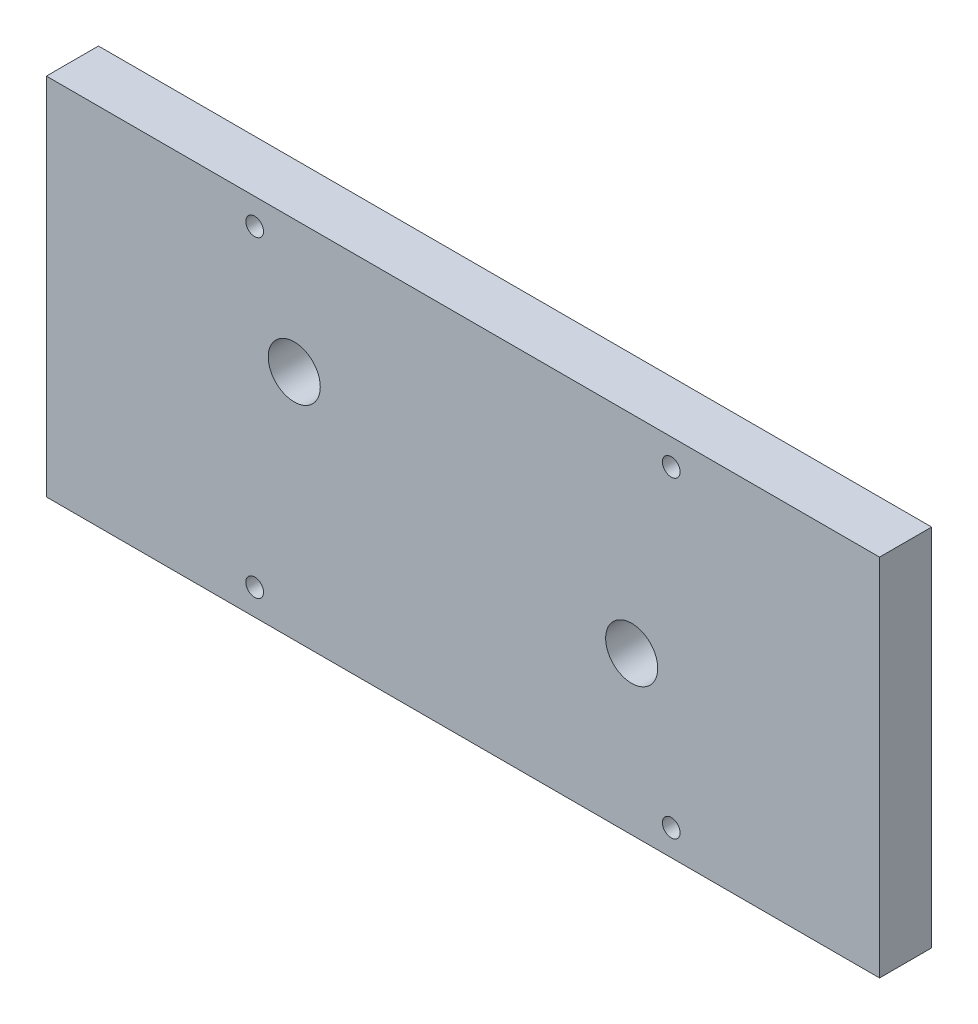
ISO-10303-21;
HEADER;
FILE_DESCRIPTION(('STEP AP214'),'2;1');
FILE_NAME('part.step','',(''),(''),'','','');
FILE_SCHEMA(('AUTOMOTIVE_DESIGN { 1 0 10303 214 1 1 1 1 }'));
ENDSEC;
DATA;
#1=APPLICATION_CONTEXT('core data for automotive mechanical design processes');
#2=APPLICATION_PROTOCOL_DEFINITION('international standard','automotive_design',2000,#1);
#3=PRODUCT_CONTEXT('',#1,'mechanical');
#4=PRODUCT('Part','Part','',(#3));
#5=PRODUCT_RELATED_PRODUCT_CATEGORY('part','',(#4));
#6=PRODUCT_DEFINITION_FORMATION('','',#4);
#7=PRODUCT_DEFINITION_CONTEXT('part definition',#1,'design');
#8=PRODUCT_DEFINITION('design','',#6,#7);
#9=PRODUCT_DEFINITION_SHAPE('','',#8);
#10=(LENGTH_UNIT() NAMED_UNIT(*) SI_UNIT(.MILLI.,.METRE.));
#11=(NAMED_UNIT(*) PLANE_ANGLE_UNIT() SI_UNIT($,.RADIAN.));
#12=(NAMED_UNIT(*) SI_UNIT($,.STERADIAN.) SOLID_ANGLE_UNIT());
#13=UNCERTAINTY_MEASURE_WITH_UNIT(LENGTH_MEASURE(1.E-05),#10,'distance_accuracy_value','');
#14=(GEOMETRIC_REPRESENTATION_CONTEXT(3) GLOBAL_UNCERTAINTY_ASSIGNED_CONTEXT((#13)) GLOBAL_UNIT_ASSIGNED_CONTEXT((#10,
#11,#12)) REPRESENTATION_CONTEXT('',''));
#15=CARTESIAN_POINT('',(0.,0.,0.));
#16=DIRECTION('',(0.,0.,1.));
#17=DIRECTION('',(1.,0.,0.));
#18=AXIS2_PLACEMENT_3D('',#15,#16,#17);
#19=CARTESIAN_POINT('',(-146.819307324439,520.108658774627,82.2731107004053));
#20=DIRECTION('',(1.,0.,0.));
#21=DIRECTION('',(0.,0.,-1.));
#22=AXIS2_PLACEMENT_3D('',#19,#20,#21);
#23=PLANE('',#22);
#24=DIRECTION('',(0.,1.,0.));
#25=VECTOR('',#24,1.);
#26=CARTESIAN_POINT('',(-146.819307324439,520.108658774627,92.2731107004053));
#27=LINE('',#26,#25);
#28=CARTESIAN_POINT('',(-146.819307324439,450.108658774627,92.2731107004053));
#29=VERTEX_POINT('',#28);
#30=CARTESIAN_POINT('',(-146.819307324439,520.108658774627,92.2731107004053));
#31=VERTEX_POINT('',#30);
#32=EDGE_CURVE('E97',#29,#31,#27,.T.);
#33=ORIENTED_EDGE('',*,*,#32,.T.);
#34=DIRECTION('',(0.,0.,1.));
#35=VECTOR('',#34,1.);
#36=CARTESIAN_POINT('',(-146.819307324439,520.108658774627,82.2731107004053));
#37=LINE('',#36,#35);
#38=CARTESIAN_POINT('',(-146.819307324439,520.108658774627,82.2731107004053));
#39=VERTEX_POINT('',#38);
#40=EDGE_CURVE('E11',#39,#31,#37,.T.);
#41=ORIENTED_EDGE('',*,*,#40,.F.);
#42=DIRECTION('',(0.,1.,0.));
#43=VECTOR('',#42,1.);
#44=CARTESIAN_POINT('',(-146.819307324439,520.108658774627,82.2731107004053));
#45=LINE('',#44,#43);
#46=CARTESIAN_POINT('',(-146.819307324439,450.108658774627,82.2731107004053));
#47=VERTEX_POINT('',#46);
#48=EDGE_CURVE('E84',#47,#39,#45,.T.);
#49=ORIENTED_EDGE('',*,*,#48,.F.);
#50=DIRECTION('',(0.,0.,1.));
#51=VECTOR('',#50,1.);
#52=CARTESIAN_POINT('',(-146.819307324439,450.108658774627,82.2731107004053));
#53=LINE('',#52,#51);
#54=EDGE_CURVE('E93',#47,#29,#53,.T.);
#55=ORIENTED_EDGE('',*,*,#54,.T.);
#56=EDGE_LOOP('',(#33,#41,#49,#55));
#57=FACE_BOUND('',#56,.T.);
#58=ADVANCED_FACE('F31',(#57),#23,.F.);
#59=CARTESIAN_POINT('',(-146.819307324439,520.108658774627,82.2731107004053));
#60=DIRECTION('',(0.,-1.,0.));
#61=DIRECTION('',(0.,0.,-1.));
#62=AXIS2_PLACEMENT_3D('',#59,#60,#61);
#63=PLANE('',#62);
#64=DIRECTION('',(1.,0.,0.));
#65=VECTOR('',#64,1.);
#66=CARTESIAN_POINT('',(-146.819307324439,520.108658774627,92.2731107004053));
#67=LINE('',#66,#65);
#68=CARTESIAN_POINT('',(13.1806926755614,520.108658774627,92.2731107004053));
#69=VERTEX_POINT('',#68);
#70=EDGE_CURVE('E88',#31,#69,#67,.T.);
#71=ORIENTED_EDGE('',*,*,#70,.T.);
#72=DIRECTION('',(0.,0.,1.));
#73=VECTOR('',#72,1.);
#74=CARTESIAN_POINT('',(13.1806926755614,520.108658774627,82.2731107004053));
#75=LINE('',#74,#73);
#76=CARTESIAN_POINT('',(13.1806926755614,520.108658774627,82.2731107004053));
#77=VERTEX_POINT('',#76);
#78=EDGE_CURVE('E40',#77,#69,#75,.T.);
#79=ORIENTED_EDGE('',*,*,#78,.F.);
#80=DIRECTION('',(1.,0.,0.));
#81=VECTOR('',#80,1.);
#82=CARTESIAN_POINT('',(-146.819307324439,520.108658774627,82.2731107004053));
#83=LINE('',#82,#81);
#84=EDGE_CURVE('E79',#39,#77,#83,.T.);
#85=ORIENTED_EDGE('',*,*,#84,.F.);
#86=ORIENTED_EDGE('',*,*,#40,.T.);
#87=EDGE_LOOP('',(#71,#79,#85,#86));
#88=FACE_BOUND('',#87,.T.);
#89=ADVANCED_FACE('F87',(#88),#63,.F.);
#90=CARTESIAN_POINT('',(13.1806926755614,520.108658774627,82.2731107004053));
#91=DIRECTION('',(-1.,0.,0.));
#92=DIRECTION('',(0.,-1.,0.));
#93=AXIS2_PLACEMENT_3D('',#90,#91,#92);
#94=PLANE('',#93);
#95=DIRECTION('',(0.,-1.,0.));
#96=VECTOR('',#95,1.);
#97=CARTESIAN_POINT('',(13.1806926755614,520.108658774627,92.2731107004053));
#98=LINE('',#97,#96);
#99=CARTESIAN_POINT('',(13.1806926755614,450.108658774627,92.2731107004053));
#100=VERTEX_POINT('',#99);
#101=EDGE_CURVE('E66',#69,#100,#98,.T.);
#102=ORIENTED_EDGE('',*,*,#101,.T.);
#103=DIRECTION('',(0.,0.,1.));
#104=VECTOR('',#103,1.);
#105=CARTESIAN_POINT('',(13.1806926755614,450.108658774627,82.2731107004053));
#106=LINE('',#105,#104);
#107=CARTESIAN_POINT('',(13.1806926755614,450.108658774627,82.2731107004053));
#108=VERTEX_POINT('',#107);
#109=EDGE_CURVE('E89',#108,#100,#106,.T.);
#110=ORIENTED_EDGE('',*,*,#109,.F.);
#111=DIRECTION('',(0.,-1.,0.));
#112=VECTOR('',#111,1.);
#113=CARTESIAN_POINT('',(13.1806926755614,520.108658774627,82.2731107004053));
#114=LINE('',#113,#112);
#115=EDGE_CURVE('E82',#77,#108,#114,.T.);
#116=ORIENTED_EDGE('',*,*,#115,.F.);
#117=ORIENTED_EDGE('',*,*,#78,.T.);
#118=EDGE_LOOP('',(#102,#110,#116,#117));
#119=FACE_BOUND('',#118,.T.);
#120=ADVANCED_FACE('F91',(#119),#94,.F.);
#121=CARTESIAN_POINT('',(-146.819307324439,450.108658774627,82.2731107004053));
#122=DIRECTION('',(0.,1.,0.));
#123=DIRECTION('',(0.,0.,1.));
#124=AXIS2_PLACEMENT_3D('',#121,#122,#123);
#125=PLANE('',#124);
#126=DIRECTION('',(-1.,0.,0.));
#127=VECTOR('',#126,1.);
#128=CARTESIAN_POINT('',(-146.819307324439,450.108658774627,92.2731107004053));
#129=LINE('',#128,#127);
#130=EDGE_CURVE('E72',#100,#29,#129,.T.);
#131=ORIENTED_EDGE('',*,*,#130,.T.);
#132=ORIENTED_EDGE('',*,*,#54,.F.);
#133=DIRECTION('',(-1.,0.,0.));
#134=VECTOR('',#133,1.);
#135=CARTESIAN_POINT('',(-146.819307324439,450.108658774627,82.2731107004053));
#136=LINE('',#135,#134);
#137=EDGE_CURVE('E49',#108,#47,#136,.T.);
#138=ORIENTED_EDGE('',*,*,#137,.F.);
#139=ORIENTED_EDGE('',*,*,#109,.T.);
#140=EDGE_LOOP('',(#131,#132,#138,#139));
#141=FACE_BOUND('',#140,.T.);
#142=ADVANCED_FACE('F158',(#141),#125,.F.);
#143=CARTESIAN_POINT('',(-146.819307324439,450.108658774627,82.2731107004053));
#144=DIRECTION('',(0.,0.,1.));
#145=DIRECTION('',(1.,0.,0.));
#146=AXIS2_PLACEMENT_3D('',#143,#144,#145);
#147=PLANE('',#146);
#148=CARTESIAN_POINT('',(-99.2193073244386,494.708658774627,82.2731107004053));
#149=DIRECTION('',(0.,0.,1.));
#150=DIRECTION('',(1.,0.,0.));
#151=AXIS2_PLACEMENT_3D('',#148,#149,#150);
#152=CIRCLE('',#151,3.29999999999999);
#153=CARTESIAN_POINT('',(-95.9193073244386,494.708658774627,82.2731107004053));
#154=VERTEX_POINT('',#153);
#155=EDGE_CURVE('E295',#154,#154,#152,.T.);
#156=ORIENTED_EDGE('',*,*,#155,.T.);
#157=EDGE_LOOP('',(#156));
#158=FACE_BOUND('',#157,.T.);
#159=CARTESIAN_POINT('',(-34.4193073244386,480.308658774627,82.2731107004053));
#160=DIRECTION('',(0.,0.,1.));
#161=DIRECTION('',(1.,0.,0.));
#162=AXIS2_PLACEMENT_3D('',#159,#160,#161);
#163=CIRCLE('',#162,3.29999999999999);
#164=CARTESIAN_POINT('',(-31.1193073244386,480.308658774627,82.2731107004053));
#165=VERTEX_POINT('',#164);
#166=EDGE_CURVE('E304',#165,#165,#163,.T.);
#167=ORIENTED_EDGE('',*,*,#166,.T.);
#168=EDGE_LOOP('',(#167));
#169=FACE_BOUND('',#168,.T.);
#170=CARTESIAN_POINT('',(-106.819307324439,515.108658774627,82.2731107004053));
#171=DIRECTION('',(0.,0.,1.));
#172=DIRECTION('',(1.,0.,0.));
#173=AXIS2_PLACEMENT_3D('',#170,#171,#172);
#174=CIRCLE('',#173,1.69999999999999);
#175=CARTESIAN_POINT('',(-105.119307324439,515.108658774627,82.2731107004053));
#176=VERTEX_POINT('',#175);
#177=EDGE_CURVE('E112',#176,#176,#174,.T.);
#178=ORIENTED_EDGE('',*,*,#177,.T.);
#179=EDGE_LOOP('',(#178));
#180=FACE_BOUND('',#179,.T.);
#181=CARTESIAN_POINT('',(-26.8193073244385,515.108658774627,82.2731107004053));
#182=DIRECTION('',(0.,0.,1.));
#183=DIRECTION('',(1.,0.,0.));
#184=AXIS2_PLACEMENT_3D('',#181,#182,#183);
#185=CIRCLE('',#184,1.69999999999999);
#186=CARTESIAN_POINT('',(-25.1193073244385,515.108658774627,82.2731107004053));
#187=VERTEX_POINT('',#186);
#188=EDGE_CURVE('E128',#187,#187,#185,.T.);
#189=ORIENTED_EDGE('',*,*,#188,.T.);
#190=EDGE_LOOP('',(#189));
#191=FACE_BOUND('',#190,.T.);
#192=CARTESIAN_POINT('',(-26.8193073244385,455.108658774627,82.2731107004053));
#193=DIRECTION('',(0.,0.,1.));
#194=DIRECTION('',(1.,0.,0.));
#195=AXIS2_PLACEMENT_3D('',#192,#193,#194);
#196=CIRCLE('',#195,1.69999999999999);
#197=CARTESIAN_POINT('',(-25.1193073244385,455.108658774627,82.2731107004053));
#198=VERTEX_POINT('',#197);
#199=EDGE_CURVE('E134',#198,#198,#196,.T.);
#200=ORIENTED_EDGE('',*,*,#199,.T.);
#201=EDGE_LOOP('',(#200));
#202=FACE_BOUND('',#201,.T.);
#203=CARTESIAN_POINT('',(-106.819307324439,455.108658774627,82.2731107004053));
#204=DIRECTION('',(0.,0.,1.));
#205=DIRECTION('',(1.,0.,0.));
#206=AXIS2_PLACEMENT_3D('',#203,#204,#205);
#207=CIRCLE('',#206,1.69999999999999);
#208=CARTESIAN_POINT('',(-105.119307324439,455.108658774627,82.2731107004053));
#209=VERTEX_POINT('',#208);
#210=EDGE_CURVE('E100',#209,#209,#207,.T.);
#211=ORIENTED_EDGE('',*,*,#210,.T.);
#212=EDGE_LOOP('',(#211));
#213=FACE_BOUND('',#212,.T.);
#214=ORIENTED_EDGE('',*,*,#48,.T.);
#215=ORIENTED_EDGE('',*,*,#84,.T.);
#216=ORIENTED_EDGE('',*,*,#115,.T.);
#217=ORIENTED_EDGE('',*,*,#137,.T.);
#218=EDGE_LOOP('',(#214,#215,#216,#217));
#219=FACE_BOUND('',#218,.T.);
#220=ADVANCED_FACE('F80',(#158,#169,#180,#191,#202,#213,#219),#147,.F.);
#221=CARTESIAN_POINT('',(-146.819307324439,450.108658774627,92.2731107004053));
#222=DIRECTION('',(0.,0.,1.));
#223=DIRECTION('',(1.,0.,0.));
#224=AXIS2_PLACEMENT_3D('',#221,#222,#223);
#225=PLANE('',#224);
#226=CARTESIAN_POINT('',(-99.2193073244386,494.708658774627,92.2731107004053));
#227=DIRECTION('',(0.,0.,1.));
#228=DIRECTION('',(1.,0.,0.));
#229=AXIS2_PLACEMENT_3D('',#226,#227,#228);
#230=CIRCLE('',#229,5.00000000000001);
#231=CARTESIAN_POINT('',(-94.2193073244386,494.708658774627,92.2731107004053));
#232=VERTEX_POINT('',#231);
#233=EDGE_CURVE('E34',#232,#232,#230,.T.);
#234=ORIENTED_EDGE('',*,*,#233,.F.);
#235=EDGE_LOOP('',(#234));
#236=FACE_BOUND('',#235,.T.);
#237=CARTESIAN_POINT('',(-34.4193073244386,480.308658774627,92.2731107004053));
#238=DIRECTION('',(0.,0.,1.));
#239=DIRECTION('',(1.,0.,0.));
#240=AXIS2_PLACEMENT_3D('',#237,#238,#239);
#241=CIRCLE('',#240,5.);
#242=CARTESIAN_POINT('',(-29.4193073244386,480.308658774627,92.2731107004053));
#243=VERTEX_POINT('',#242);
#244=EDGE_CURVE('E105',#243,#243,#241,.T.);
#245=ORIENTED_EDGE('',*,*,#244,.F.);
#246=EDGE_LOOP('',(#245));
#247=FACE_BOUND('',#246,.T.);
#248=CARTESIAN_POINT('',(-106.819307324439,515.108658774627,92.2731107004053));
#249=DIRECTION('',(0.,0.,1.));
#250=DIRECTION('',(1.,0.,0.));
#251=AXIS2_PLACEMENT_3D('',#248,#249,#250);
#252=CIRCLE('',#251,1.69999999999999);
#253=CARTESIAN_POINT('',(-105.119307324439,515.108658774627,92.2731107004053));
#254=VERTEX_POINT('',#253);
#255=EDGE_CURVE('E107',#254,#254,#252,.T.);
#256=ORIENTED_EDGE('',*,*,#255,.F.);
#257=EDGE_LOOP('',(#256));
#258=FACE_BOUND('',#257,.T.);
#259=CARTESIAN_POINT('',(-26.8193073244385,515.108658774627,92.2731107004053));
#260=DIRECTION('',(0.,0.,1.));
#261=DIRECTION('',(1.,0.,0.));
#262=AXIS2_PLACEMENT_3D('',#259,#260,#261);
#263=CIRCLE('',#262,1.69999999999999);
#264=CARTESIAN_POINT('',(-25.1193073244386,515.108658774627,92.2731107004053));
#265=VERTEX_POINT('',#264);
#266=EDGE_CURVE('E125',#265,#265,#263,.T.);
#267=ORIENTED_EDGE('',*,*,#266,.F.);
#268=EDGE_LOOP('',(#267));
#269=FACE_BOUND('',#268,.T.);
#270=CARTESIAN_POINT('',(-26.8193073244385,455.108658774627,92.2731107004053));
#271=DIRECTION('',(0.,0.,1.));
#272=DIRECTION('',(1.,0.,0.));
#273=AXIS2_PLACEMENT_3D('',#270,#271,#272);
#274=CIRCLE('',#273,1.69999999999999);
#275=CARTESIAN_POINT('',(-25.1193073244386,455.108658774627,92.2731107004053));
#276=VERTEX_POINT('',#275);
#277=EDGE_CURVE('E131',#276,#276,#274,.T.);
#278=ORIENTED_EDGE('',*,*,#277,.F.);
#279=EDGE_LOOP('',(#278));
#280=FACE_BOUND('',#279,.T.);
#281=CARTESIAN_POINT('',(-106.819307324439,455.108658774627,92.2731107004053));
#282=DIRECTION('',(0.,0.,1.));
#283=DIRECTION('',(1.,0.,0.));
#284=AXIS2_PLACEMENT_3D('',#281,#282,#283);
#285=CIRCLE('',#284,1.69999999999999);
#286=CARTESIAN_POINT('',(-105.119307324439,455.108658774627,92.2731107004053));
#287=VERTEX_POINT('',#286);
#288=EDGE_CURVE('E137',#287,#287,#285,.T.);
#289=ORIENTED_EDGE('',*,*,#288,.F.);
#290=EDGE_LOOP('',(#289));
#291=FACE_BOUND('',#290,.T.);
#292=ORIENTED_EDGE('',*,*,#32,.F.);
#293=ORIENTED_EDGE('',*,*,#130,.F.);
#294=ORIENTED_EDGE('',*,*,#101,.F.);
#295=ORIENTED_EDGE('',*,*,#70,.F.);
#296=EDGE_LOOP('',(#292,#293,#294,#295));
#297=FACE_BOUND('',#296,.T.);
#298=ADVANCED_FACE('F148',(#236,#247,#258,#269,#280,#291,#297),#225,.T.);
#299=CARTESIAN_POINT('',(-106.819307324439,455.108658774627,92.2731107004053));
#300=DIRECTION('',(0.,0.,1.));
#301=DIRECTION('',(1.,0.,0.));
#302=AXIS2_PLACEMENT_3D('',#299,#300,#301);
#303=CYLINDRICAL_SURFACE('',#302,1.69999999999999);
#304=ORIENTED_EDGE('',*,*,#210,.F.);
#305=EDGE_LOOP('',(#304));
#306=FACE_BOUND('',#305,.T.);
#307=ORIENTED_EDGE('',*,*,#288,.T.);
#308=EDGE_LOOP('',(#307));
#309=FACE_BOUND('',#308,.T.);
#310=ADVANCED_FACE('F144',(#306,#309),#303,.F.);
#311=CARTESIAN_POINT('',(-26.8193073244385,455.108658774627,92.2731107004053));
#312=DIRECTION('',(0.,0.,1.));
#313=DIRECTION('',(1.,0.,0.));
#314=AXIS2_PLACEMENT_3D('',#311,#312,#313);
#315=CYLINDRICAL_SURFACE('',#314,1.69999999999999);
#316=ORIENTED_EDGE('',*,*,#199,.F.);
#317=EDGE_LOOP('',(#316));
#318=FACE_BOUND('',#317,.T.);
#319=ORIENTED_EDGE('',*,*,#277,.T.);
#320=EDGE_LOOP('',(#319));
#321=FACE_BOUND('',#320,.T.);
#322=ADVANCED_FACE('F147',(#318,#321),#315,.F.);
#323=CARTESIAN_POINT('',(-26.8193073244385,515.108658774627,92.2731107004053));
#324=DIRECTION('',(0.,0.,1.));
#325=DIRECTION('',(1.,0.,0.));
#326=AXIS2_PLACEMENT_3D('',#323,#324,#325);
#327=CYLINDRICAL_SURFACE('',#326,1.69999999999999);
#328=ORIENTED_EDGE('',*,*,#188,.F.);
#329=EDGE_LOOP('',(#328));
#330=FACE_BOUND('',#329,.T.);
#331=ORIENTED_EDGE('',*,*,#266,.T.);
#332=EDGE_LOOP('',(#331));
#333=FACE_BOUND('',#332,.T.);
#334=ADVANCED_FACE('F199',(#330,#333),#327,.F.);
#335=CARTESIAN_POINT('',(-106.819307324439,515.108658774627,92.2731107004053));
#336=DIRECTION('',(0.,0.,1.));
#337=DIRECTION('',(1.,0.,0.));
#338=AXIS2_PLACEMENT_3D('',#335,#336,#337);
#339=CYLINDRICAL_SURFACE('',#338,1.69999999999999);
#340=ORIENTED_EDGE('',*,*,#177,.F.);
#341=EDGE_LOOP('',(#340));
#342=FACE_BOUND('',#341,.T.);
#343=ORIENTED_EDGE('',*,*,#255,.T.);
#344=EDGE_LOOP('',(#343));
#345=FACE_BOUND('',#344,.T.);
#346=ADVANCED_FACE('F209',(#342,#345),#339,.F.);
#347=CARTESIAN_POINT('',(-34.4193073244386,480.308658774627,83.7731107004053));
#348=DIRECTION('',(0.,0.,1.));
#349=DIRECTION('',(1.,0.,0.));
#350=AXIS2_PLACEMENT_3D('',#347,#348,#349);
#351=CYLINDRICAL_SURFACE('',#350,5.);
#352=ORIENTED_EDGE('',*,*,#244,.T.);
#353=EDGE_LOOP('',(#352));
#354=FACE_BOUND('',#353,.T.);
#355=CARTESIAN_POINT('',(-34.4193073244386,480.308658774627,83.7731107004053));
#356=DIRECTION('',(0.,0.,1.));
#357=DIRECTION('',(1.,0.,0.));
#358=AXIS2_PLACEMENT_3D('',#355,#356,#357);
#359=CIRCLE('',#358,5.);
#360=CARTESIAN_POINT('',(-29.4193073244386,480.308658774627,83.7731107004053));
#361=VERTEX_POINT('',#360);
#362=EDGE_CURVE('E108',#361,#361,#359,.T.);
#363=ORIENTED_EDGE('',*,*,#362,.F.);
#364=EDGE_LOOP('',(#363));
#365=FACE_BOUND('',#364,.T.);
#366=ADVANCED_FACE('F219',(#354,#365),#351,.F.);
#367=CARTESIAN_POINT('',(-34.4193073244386,480.308658774627,83.7731107004053));
#368=DIRECTION('',(0.,0.,1.));
#369=DIRECTION('',(1.,0.,0.));
#370=AXIS2_PLACEMENT_3D('',#367,#368,#369);
#371=PLANE('',#370);
#372=CARTESIAN_POINT('',(-34.4193073244386,480.308658774627,83.7731107004053));
#373=DIRECTION('',(0.,0.,1.));
#374=DIRECTION('',(1.,0.,0.));
#375=AXIS2_PLACEMENT_3D('',#372,#373,#374);
#376=CIRCLE('',#375,3.29999999999999);
#377=CARTESIAN_POINT('',(-31.1193073244386,480.308658774627,83.7731107004053));
#378=VERTEX_POINT('',#377);
#379=EDGE_CURVE('E300',#378,#378,#376,.T.);
#380=ORIENTED_EDGE('',*,*,#379,.F.);
#381=EDGE_LOOP('',(#380));
#382=FACE_BOUND('',#381,.T.);
#383=ORIENTED_EDGE('',*,*,#362,.T.);
#384=EDGE_LOOP('',(#383));
#385=FACE_BOUND('',#384,.T.);
#386=ADVANCED_FACE('F234',(#382,#385),#371,.T.);
#387=CARTESIAN_POINT('',(-99.2193073244386,494.708658774627,83.7731107004053));
#388=DIRECTION('',(0.,0.,1.));
#389=DIRECTION('',(1.,0.,0.));
#390=AXIS2_PLACEMENT_3D('',#387,#388,#389);
#391=CYLINDRICAL_SURFACE('',#390,5.00000000000001);
#392=ORIENTED_EDGE('',*,*,#233,.T.);
#393=EDGE_LOOP('',(#392));
#394=FACE_BOUND('',#393,.T.);
#395=CARTESIAN_POINT('',(-99.2193073244386,494.708658774627,83.7731107004053));
#396=DIRECTION('',(0.,0.,1.));
#397=DIRECTION('',(1.,0.,0.));
#398=AXIS2_PLACEMENT_3D('',#395,#396,#397);
#399=CIRCLE('',#398,5.00000000000001);
#400=CARTESIAN_POINT('',(-94.2193073244386,494.708658774627,83.7731107004053));
#401=VERTEX_POINT('',#400);
#402=EDGE_CURVE('E119',#401,#401,#399,.T.);
#403=ORIENTED_EDGE('',*,*,#402,.F.);
#404=EDGE_LOOP('',(#403));
#405=FACE_BOUND('',#404,.T.);
#406=ADVANCED_FACE('F241',(#394,#405),#391,.F.);
#407=CARTESIAN_POINT('',(-99.2193073244386,494.708658774627,83.7731107004053));
#408=DIRECTION('',(0.,0.,1.));
#409=DIRECTION('',(1.,0.,0.));
#410=AXIS2_PLACEMENT_3D('',#407,#408,#409);
#411=PLANE('',#410);
#412=CARTESIAN_POINT('',(-99.2193073244386,494.708658774627,83.7731107004053));
#413=DIRECTION('',(0.,0.,1.));
#414=DIRECTION('',(1.,0.,0.));
#415=AXIS2_PLACEMENT_3D('',#412,#413,#414);
#416=CIRCLE('',#415,3.29999999999998);
#417=CARTESIAN_POINT('',(-95.9193073244386,494.708658774627,83.7731107004053));
#418=VERTEX_POINT('',#417);
#419=EDGE_CURVE('E298',#418,#418,#416,.T.);
#420=ORIENTED_EDGE('',*,*,#419,.F.);
#421=EDGE_LOOP('',(#420));
#422=FACE_BOUND('',#421,.T.);
#423=ORIENTED_EDGE('',*,*,#402,.T.);
#424=EDGE_LOOP('',(#423));
#425=FACE_BOUND('',#424,.T.);
#426=ADVANCED_FACE('F246',(#422,#425),#411,.T.);
#427=CARTESIAN_POINT('',(-34.4193073244386,480.308658774627,83.7731107004053));
#428=DIRECTION('',(0.,0.,1.));
#429=DIRECTION('',(1.,0.,0.));
#430=AXIS2_PLACEMENT_3D('',#427,#428,#429);
#431=CYLINDRICAL_SURFACE('',#430,3.29999999999999);
#432=ORIENTED_EDGE('',*,*,#166,.F.);
#433=EDGE_LOOP('',(#432));
#434=FACE_BOUND('',#433,.T.);
#435=ORIENTED_EDGE('',*,*,#379,.T.);
#436=EDGE_LOOP('',(#435));
#437=FACE_BOUND('',#436,.T.);
#438=ADVANCED_FACE('F268',(#434,#437),#431,.F.);
#439=CARTESIAN_POINT('',(-99.2193073244386,494.708658774627,83.7731107004053));
#440=DIRECTION('',(0.,0.,1.));
#441=DIRECTION('',(1.,0.,0.));
#442=AXIS2_PLACEMENT_3D('',#439,#440,#441);
#443=CYLINDRICAL_SURFACE('',#442,3.29999999999999);
#444=ORIENTED_EDGE('',*,*,#155,.F.);
#445=EDGE_LOOP('',(#444));
#446=FACE_BOUND('',#445,.T.);
#447=ORIENTED_EDGE('',*,*,#419,.T.);
#448=EDGE_LOOP('',(#447));
#449=FACE_BOUND('',#448,.T.);
#450=ADVANCED_FACE('F278',(#446,#449),#443,.F.);
#451=CLOSED_SHELL('',(#58,#89,#120,#142,#220,#298,#310,#322,#334,#346,#366,#386,#406,#426,#438,#450));
#452=MANIFOLD_SOLID_BREP('B2',#451);
#453=ADVANCED_BREP_SHAPE_REPRESENTATION('',(#18,#452),#14);
#454=SHAPE_DEFINITION_REPRESENTATION(#9,#453);
ENDSEC;
END-ISO-10303-21;
